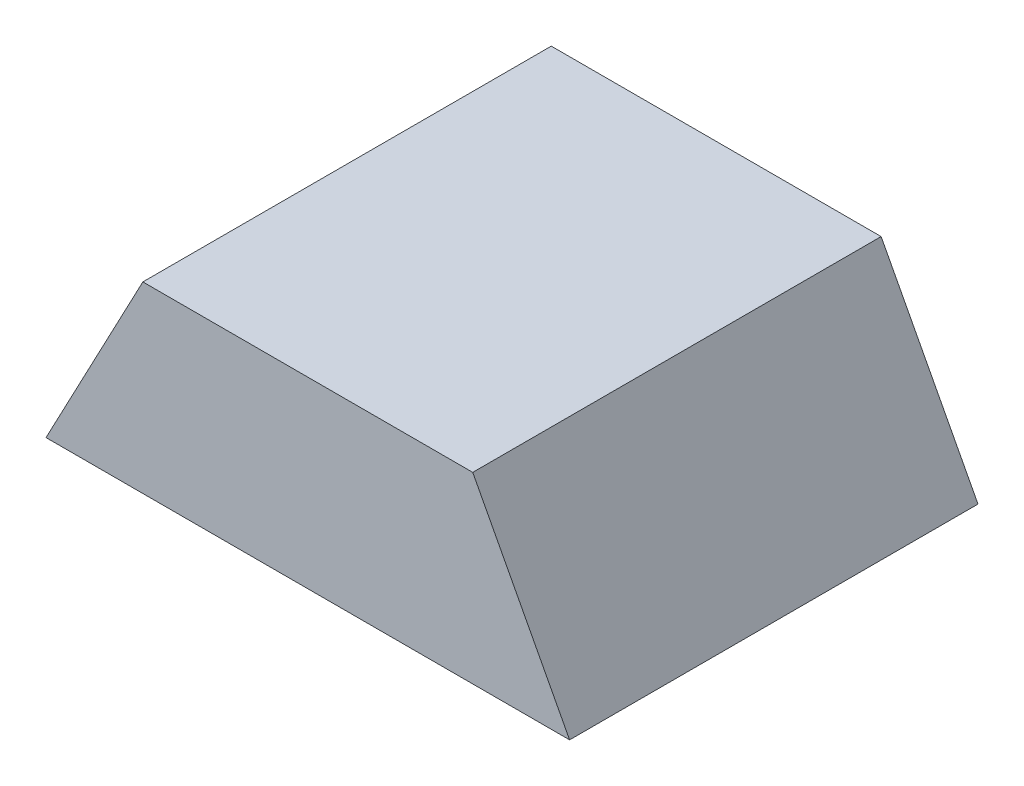
ISO-10303-21;
HEADER;
FILE_DESCRIPTION(('STEP AP214'),'2;1');
FILE_NAME('part.step','',(''),(''),'','','');
FILE_SCHEMA(('AUTOMOTIVE_DESIGN { 1 0 10303 214 1 1 1 1 }'));
ENDSEC;
DATA;
#1=APPLICATION_CONTEXT('core data for automotive mechanical design processes');
#2=APPLICATION_PROTOCOL_DEFINITION('international standard','automotive_design',2000,#1);
#3=PRODUCT_CONTEXT('',#1,'mechanical');
#4=PRODUCT('Part','Part','',(#3));
#5=PRODUCT_RELATED_PRODUCT_CATEGORY('part','',(#4));
#6=PRODUCT_DEFINITION_FORMATION('','',#4);
#7=PRODUCT_DEFINITION_CONTEXT('part definition',#1,'design');
#8=PRODUCT_DEFINITION('design','',#6,#7);
#9=PRODUCT_DEFINITION_SHAPE('','',#8);
#10=(LENGTH_UNIT() NAMED_UNIT(*) SI_UNIT(.MILLI.,.METRE.));
#11=(NAMED_UNIT(*) PLANE_ANGLE_UNIT() SI_UNIT($,.RADIAN.));
#12=(NAMED_UNIT(*) SI_UNIT($,.STERADIAN.) SOLID_ANGLE_UNIT());
#13=UNCERTAINTY_MEASURE_WITH_UNIT(LENGTH_MEASURE(1.E-05),#10,'distance_accuracy_value','');
#14=(GEOMETRIC_REPRESENTATION_CONTEXT(3) GLOBAL_UNCERTAINTY_ASSIGNED_CONTEXT((#13)) GLOBAL_UNIT_ASSIGNED_CONTEXT((#10,
#11,#12)) REPRESENTATION_CONTEXT('',''));
#15=CARTESIAN_POINT('',(0.,0.,0.));
#16=DIRECTION('',(0.,0.,1.));
#17=DIRECTION('',(1.,0.,0.));
#18=AXIS2_PLACEMENT_3D('',#15,#16,#17);
#19=CARTESIAN_POINT('',(2473.73117140466,0.,780.));
#20=DIRECTION('',(0.,1.,0.));
#21=DIRECTION('',(0.,0.,1.));
#22=AXIS2_PLACEMENT_3D('',#19,#20,#21);
#23=PLANE('',#22);
#24=DIRECTION('',(1.,0.,0.));
#25=VECTOR('',#24,1.);
#26=CARTESIAN_POINT('',(2473.73117140466,0.,0.));
#27=LINE('',#26,#25);
#28=CARTESIAN_POINT('',(2473.73117140466,0.,0.));
#29=VERTEX_POINT('',#28);
#30=CARTESIAN_POINT('',(3473.73117140466,0.,0.));
#31=VERTEX_POINT('',#30);
#32=EDGE_CURVE('E156',#29,#31,#27,.T.);
#33=ORIENTED_EDGE('',*,*,#32,.T.);
#34=DIRECTION('',(0.,0.,-1.));
#35=VECTOR('',#34,1.);
#36=CARTESIAN_POINT('',(3473.73117140466,0.,780.));
#37=LINE('',#36,#35);
#38=CARTESIAN_POINT('',(3473.73117140466,0.,780.));
#39=VERTEX_POINT('',#38);
#40=EDGE_CURVE('E41',#39,#31,#37,.T.);
#41=ORIENTED_EDGE('',*,*,#40,.F.);
#42=DIRECTION('',(1.,0.,0.));
#43=VECTOR('',#42,1.);
#44=CARTESIAN_POINT('',(2473.73117140466,0.,780.));
#45=LINE('',#44,#43);
#46=CARTESIAN_POINT('',(2473.73117140466,0.,780.));
#47=VERTEX_POINT('',#46);
#48=EDGE_CURVE('E85',#47,#39,#45,.T.);
#49=ORIENTED_EDGE('',*,*,#48,.F.);
#50=DIRECTION('',(0.,0.,-1.));
#51=VECTOR('',#50,1.);
#52=CARTESIAN_POINT('',(2473.73117140466,0.,780.));
#53=LINE('',#52,#51);
#54=EDGE_CURVE('E11',#47,#29,#53,.T.);
#55=ORIENTED_EDGE('',*,*,#54,.T.);
#56=EDGE_LOOP('',(#33,#41,#49,#55));
#57=FACE_BOUND('',#56,.T.);
#58=DIRECTION('',(1.,0.,0.));
#59=VECTOR('',#58,1.);
#60=CARTESIAN_POINT('',(2473.73117140466,0.,6.00000000000001));
#61=LINE('',#60,#59);
#62=CARTESIAN_POINT('',(2480.51777285042,0.,6.));
#63=VERTEX_POINT('',#62);
#64=CARTESIAN_POINT('',(3466.94456995889,0.,6.));
#65=VERTEX_POINT('',#64);
#66=EDGE_CURVE('E129',#63,#65,#61,.T.);
#67=ORIENTED_EDGE('',*,*,#66,.F.);
#68=DIRECTION('',(0.,0.,-1.));
#69=VECTOR('',#68,1.);
#70=CARTESIAN_POINT('',(2480.51777285042,0.,780.));
#71=LINE('',#70,#69);
#72=CARTESIAN_POINT('',(2480.51777285042,0.,774.));
#73=VERTEX_POINT('',#72);
#74=EDGE_CURVE('E128',#73,#63,#71,.T.);
#75=ORIENTED_EDGE('',*,*,#74,.F.);
#76=DIRECTION('',(1.,0.,0.));
#77=VECTOR('',#76,1.);
#78=CARTESIAN_POINT('',(2473.73117140466,0.,774.));
#79=LINE('',#78,#77);
#80=CARTESIAN_POINT('',(3466.94456995889,0.,774.));
#81=VERTEX_POINT('',#80);
#82=EDGE_CURVE('E133',#73,#81,#79,.T.);
#83=ORIENTED_EDGE('',*,*,#82,.T.);
#84=DIRECTION('',(0.,0.,-1.));
#85=VECTOR('',#84,1.);
#86=CARTESIAN_POINT('',(3466.94456995889,0.,780.));
#87=LINE('',#86,#85);
#88=EDGE_CURVE('E138',#81,#65,#87,.T.);
#89=ORIENTED_EDGE('',*,*,#88,.T.);
#90=EDGE_LOOP('',(#67,#75,#83,#89));
#91=FACE_BOUND('',#90,.T.);
#92=ADVANCED_FACE('F33',(#57,#91),#23,.F.);
#93=CARTESIAN_POINT('',(2658.73117140466,350.,780.));
#94=DIRECTION('',(0.88409494029493,-0.467307325584463,0.));
#95=DIRECTION('',(0.467307325584463,0.88409494029493,0.));
#96=AXIS2_PLACEMENT_3D('',#93,#94,#95);
#97=PLANE('',#96);
#98=DIRECTION('',(-0.467307325584463,-0.88409494029493,0.));
#99=VECTOR('',#98,1.);
#100=CARTESIAN_POINT('',(2658.73117140466,350.,0.));
#101=LINE('',#100,#99);
#102=CARTESIAN_POINT('',(2658.73117140466,350.,0.));
#103=VERTEX_POINT('',#102);
#104=EDGE_CURVE('E141',#103,#29,#101,.T.);
#105=ORIENTED_EDGE('',*,*,#104,.T.);
#106=ORIENTED_EDGE('',*,*,#54,.F.);
#107=DIRECTION('',(-0.467307325584463,-0.88409494029493,0.));
#108=VECTOR('',#107,1.);
#109=CARTESIAN_POINT('',(2658.73117140466,350.,780.));
#110=LINE('',#109,#108);
#111=CARTESIAN_POINT('',(2658.73117140466,350.,780.));
#112=VERTEX_POINT('',#111);
#113=EDGE_CURVE('E147',#112,#47,#110,.T.);
#114=ORIENTED_EDGE('',*,*,#113,.F.);
#115=DIRECTION('',(0.,0.,-1.));
#116=VECTOR('',#115,1.);
#117=CARTESIAN_POINT('',(2658.73117140466,350.,780.));
#118=LINE('',#117,#116);
#119=EDGE_CURVE('E153',#112,#103,#118,.T.);
#120=ORIENTED_EDGE('',*,*,#119,.T.);
#121=EDGE_LOOP('',(#105,#106,#114,#120));
#122=FACE_BOUND('',#121,.T.);
#123=ADVANCED_FACE('F35',(#122),#97,.F.);
#124=CARTESIAN_POINT('',(3473.73117140466,0.,780.));
#125=DIRECTION('',(-0.88409494029493,-0.467307325584463,0.));
#126=DIRECTION('',(0.467307325584463,-0.88409494029493,0.));
#127=AXIS2_PLACEMENT_3D('',#124,#125,#126);
#128=PLANE('',#127);
#129=DIRECTION('',(-0.467307325584463,0.88409494029493,0.));
#130=VECTOR('',#129,1.);
#131=CARTESIAN_POINT('',(3473.73117140466,0.,0.));
#132=LINE('',#131,#130);
#133=CARTESIAN_POINT('',(3288.73117140466,350.,0.));
#134=VERTEX_POINT('',#133);
#135=EDGE_CURVE('E158',#31,#134,#132,.T.);
#136=ORIENTED_EDGE('',*,*,#135,.T.);
#137=DIRECTION('',(0.,0.,-1.));
#138=VECTOR('',#137,1.);
#139=CARTESIAN_POINT('',(3288.73117140466,350.,780.));
#140=LINE('',#139,#138);
#141=CARTESIAN_POINT('',(3288.73117140466,350.,780.));
#142=VERTEX_POINT('',#141);
#143=EDGE_CURVE('E162',#142,#134,#140,.T.);
#144=ORIENTED_EDGE('',*,*,#143,.F.);
#145=DIRECTION('',(-0.467307325584463,0.88409494029493,0.));
#146=VECTOR('',#145,1.);
#147=CARTESIAN_POINT('',(3473.73117140466,0.,780.));
#148=LINE('',#147,#146);
#149=EDGE_CURVE('E150',#39,#142,#148,.T.);
#150=ORIENTED_EDGE('',*,*,#149,.F.);
#151=ORIENTED_EDGE('',*,*,#40,.T.);
#152=EDGE_LOOP('',(#136,#144,#150,#151));
#153=FACE_BOUND('',#152,.T.);
#154=ADVANCED_FACE('F167',(#153),#128,.F.);
#155=CARTESIAN_POINT('',(3288.73117140466,350.,780.));
#156=DIRECTION('',(0.,-1.,0.));
#157=DIRECTION('',(0.,0.,-1.));
#158=AXIS2_PLACEMENT_3D('',#155,#156,#157);
#159=PLANE('',#158);
#160=DIRECTION('',(-1.,0.,0.));
#161=VECTOR('',#160,1.);
#162=CARTESIAN_POINT('',(3288.73117140466,350.,0.));
#163=LINE('',#162,#161);
#164=EDGE_CURVE('E78',#134,#103,#163,.T.);
#165=ORIENTED_EDGE('',*,*,#164,.T.);
#166=ORIENTED_EDGE('',*,*,#119,.F.);
#167=DIRECTION('',(-1.,0.,0.));
#168=VECTOR('',#167,1.);
#169=CARTESIAN_POINT('',(3288.73117140466,350.,780.));
#170=LINE('',#169,#168);
#171=EDGE_CURVE('E57',#142,#112,#170,.T.);
#172=ORIENTED_EDGE('',*,*,#171,.F.);
#173=ORIENTED_EDGE('',*,*,#143,.T.);
#174=EDGE_LOOP('',(#165,#166,#172,#173));
#175=FACE_BOUND('',#174,.T.);
#176=ADVANCED_FACE('F175',(#175),#159,.F.);
#177=CARTESIAN_POINT('',(0.,0.,780.));
#178=DIRECTION('',(0.,0.,1.));
#179=DIRECTION('',(1.,0.,0.));
#180=AXIS2_PLACEMENT_3D('',#177,#178,#179);
#181=PLANE('',#180);
#182=ORIENTED_EDGE('',*,*,#113,.T.);
#183=ORIENTED_EDGE('',*,*,#48,.T.);
#184=ORIENTED_EDGE('',*,*,#149,.T.);
#185=ORIENTED_EDGE('',*,*,#171,.T.);
#186=EDGE_LOOP('',(#182,#183,#184,#185));
#187=FACE_BOUND('',#186,.T.);
#188=ADVANCED_FACE('F177',(#187),#181,.T.);
#189=CARTESIAN_POINT('',(0.,0.,0.));
#190=DIRECTION('',(0.,0.,1.));
#191=DIRECTION('',(1.,0.,0.));
#192=AXIS2_PLACEMENT_3D('',#189,#190,#191);
#193=PLANE('',#192);
#194=ORIENTED_EDGE('',*,*,#104,.F.);
#195=ORIENTED_EDGE('',*,*,#164,.F.);
#196=ORIENTED_EDGE('',*,*,#135,.F.);
#197=ORIENTED_EDGE('',*,*,#32,.F.);
#198=EDGE_LOOP('',(#194,#195,#196,#197));
#199=FACE_BOUND('',#198,.T.);
#200=ADVANCED_FACE('F171',(#199),#193,.F.);
#201=CARTESIAN_POINT('',(2664.03574104642,347.196156046493,780.));
#202=DIRECTION('',(0.88409494029493,-0.467307325584463,0.));
#203=DIRECTION('',(0.467307325584463,0.88409494029493,0.));
#204=AXIS2_PLACEMENT_3D('',#201,#202,#203);
#205=PLANE('',#204);
#206=DIRECTION('',(-0.467307325584463,-0.884094940294931,0.));
#207=VECTOR('',#206,1.);
#208=CARTESIAN_POINT('',(2664.03574104642,347.196156046493,5.99999999999989));
#209=LINE('',#208,#207);
#210=CARTESIAN_POINT('',(2662.34634427899,344.,6.));
#211=VERTEX_POINT('',#210);
#212=EDGE_CURVE('E112',#211,#63,#209,.T.);
#213=ORIENTED_EDGE('',*,*,#212,.F.);
#214=DIRECTION('',(0.,0.,-1.));
#215=VECTOR('',#214,1.);
#216=CARTESIAN_POINT('',(2662.34634427899,344.,780.));
#217=LINE('',#216,#215);
#218=CARTESIAN_POINT('',(2662.34634427899,344.,774.));
#219=VERTEX_POINT('',#218);
#220=EDGE_CURVE('E120',#219,#211,#217,.T.);
#221=ORIENTED_EDGE('',*,*,#220,.F.);
#222=DIRECTION('',(-0.467307325584463,-0.884094940294931,0.));
#223=VECTOR('',#222,1.);
#224=CARTESIAN_POINT('',(2664.03574104642,347.196156046493,774.));
#225=LINE('',#224,#223);
#226=EDGE_CURVE('E48',#219,#73,#225,.T.);
#227=ORIENTED_EDGE('',*,*,#226,.T.);
#228=ORIENTED_EDGE('',*,*,#74,.T.);
#229=EDGE_LOOP('',(#213,#221,#227,#228));
#230=FACE_BOUND('',#229,.T.);
#231=ADVANCED_FACE('F126',(#230),#205,.T.);
#232=CARTESIAN_POINT('',(3468.42660176289,-2.80384395350678,780.));
#233=DIRECTION('',(-0.88409494029493,-0.467307325584463,0.));
#234=DIRECTION('',(0.467307325584463,-0.88409494029493,0.));
#235=AXIS2_PLACEMENT_3D('',#232,#233,#234);
#236=PLANE('',#235);
#237=DIRECTION('',(-0.467307325584463,0.884094940294931,0.));
#238=VECTOR('',#237,1.);
#239=CARTESIAN_POINT('',(3468.42660176289,-2.80384395350678,5.99999999999989));
#240=LINE('',#239,#238);
#241=CARTESIAN_POINT('',(3285.11599853032,344.,6.));
#242=VERTEX_POINT('',#241);
#243=EDGE_CURVE('E115',#65,#242,#240,.T.);
#244=ORIENTED_EDGE('',*,*,#243,.F.);
#245=ORIENTED_EDGE('',*,*,#88,.F.);
#246=DIRECTION('',(-0.467307325584463,0.884094940294931,0.));
#247=VECTOR('',#246,1.);
#248=CARTESIAN_POINT('',(3468.42660176289,-2.80384395350678,774.));
#249=LINE('',#248,#247);
#250=CARTESIAN_POINT('',(3285.11599853032,344.,774.));
#251=VERTEX_POINT('',#250);
#252=EDGE_CURVE('E136',#81,#251,#249,.T.);
#253=ORIENTED_EDGE('',*,*,#252,.T.);
#254=DIRECTION('',(0.,0.,-1.));
#255=VECTOR('',#254,1.);
#256=CARTESIAN_POINT('',(3285.11599853032,344.,780.));
#257=LINE('',#256,#255);
#258=EDGE_CURVE('E124',#251,#242,#257,.T.);
#259=ORIENTED_EDGE('',*,*,#258,.T.);
#260=EDGE_LOOP('',(#244,#245,#253,#259));
#261=FACE_BOUND('',#260,.T.);
#262=ADVANCED_FACE('F192',(#261),#236,.T.);
#263=CARTESIAN_POINT('',(3288.73117140466,344.,780.));
#264=DIRECTION('',(0.,-1.,0.));
#265=DIRECTION('',(0.,0.,-1.));
#266=AXIS2_PLACEMENT_3D('',#263,#264,#265);
#267=PLANE('',#266);
#268=DIRECTION('',(-1.,0.,0.));
#269=VECTOR('',#268,1.);
#270=CARTESIAN_POINT('',(3288.73117140466,344.,6.00000000000001));
#271=LINE('',#270,#269);
#272=EDGE_CURVE('E108',#242,#211,#271,.T.);
#273=ORIENTED_EDGE('',*,*,#272,.F.);
#274=ORIENTED_EDGE('',*,*,#258,.F.);
#275=DIRECTION('',(-1.,0.,0.));
#276=VECTOR('',#275,1.);
#277=CARTESIAN_POINT('',(3288.73117140466,344.,774.));
#278=LINE('',#277,#276);
#279=EDGE_CURVE('E123',#251,#219,#278,.T.);
#280=ORIENTED_EDGE('',*,*,#279,.T.);
#281=ORIENTED_EDGE('',*,*,#220,.T.);
#282=EDGE_LOOP('',(#273,#274,#280,#281));
#283=FACE_BOUND('',#282,.T.);
#284=ADVANCED_FACE('F121',(#283),#267,.T.);
#285=CARTESIAN_POINT('',(0.,0.,774.));
#286=DIRECTION('',(0.,0.,1.));
#287=DIRECTION('',(1.,0.,0.));
#288=AXIS2_PLACEMENT_3D('',#285,#286,#287);
#289=PLANE('',#288);
#290=ORIENTED_EDGE('',*,*,#226,.F.);
#291=ORIENTED_EDGE('',*,*,#279,.F.);
#292=ORIENTED_EDGE('',*,*,#252,.F.);
#293=ORIENTED_EDGE('',*,*,#82,.F.);
#294=EDGE_LOOP('',(#290,#291,#292,#293));
#295=FACE_BOUND('',#294,.T.);
#296=ADVANCED_FACE('F195',(#295),#289,.F.);
#297=CARTESIAN_POINT('',(0.,0.,6.));
#298=DIRECTION('',(0.,0.,1.));
#299=DIRECTION('',(1.,0.,0.));
#300=AXIS2_PLACEMENT_3D('',#297,#298,#299);
#301=PLANE('',#300);
#302=ORIENTED_EDGE('',*,*,#212,.T.);
#303=ORIENTED_EDGE('',*,*,#66,.T.);
#304=ORIENTED_EDGE('',*,*,#243,.T.);
#305=ORIENTED_EDGE('',*,*,#272,.T.);
#306=EDGE_LOOP('',(#302,#303,#304,#305));
#307=FACE_BOUND('',#306,.T.);
#308=ADVANCED_FACE('F110',(#307),#301,.T.);
#309=CLOSED_SHELL('',(#92,#123,#154,#176,#188,#200,#231,#262,#284,#296,#308));
#310=MANIFOLD_SOLID_BREP('B2',#309);
#311=ADVANCED_BREP_SHAPE_REPRESENTATION('',(#18,#310),#14);
#312=SHAPE_DEFINITION_REPRESENTATION(#9,#311);
ENDSEC;
END-ISO-10303-21;
